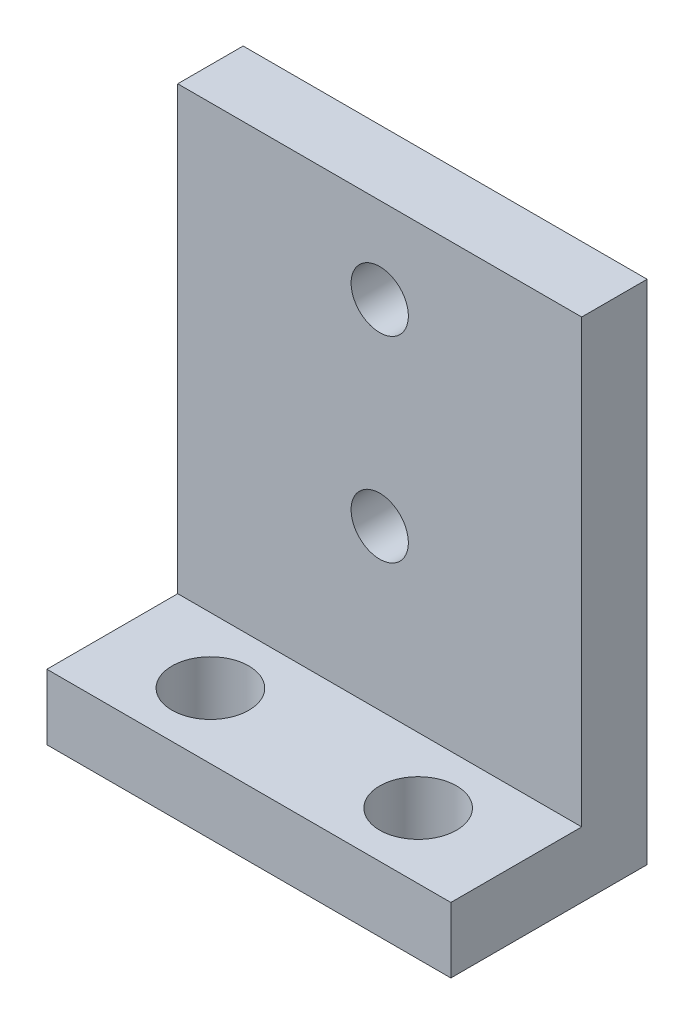
ISO-10303-21;
HEADER;
FILE_DESCRIPTION(('STEP AP214'),'2;1');
FILE_NAME('part.step','',(''),(''),'','','');
FILE_SCHEMA(('AUTOMOTIVE_DESIGN { 1 0 10303 214 1 1 1 1 }'));
ENDSEC;
DATA;
#1=APPLICATION_CONTEXT('core data for automotive mechanical design processes');
#2=APPLICATION_PROTOCOL_DEFINITION('international standard','automotive_design',2000,#1);
#3=PRODUCT_CONTEXT('',#1,'mechanical');
#4=PRODUCT('Part','Part','',(#3));
#5=PRODUCT_RELATED_PRODUCT_CATEGORY('part','',(#4));
#6=PRODUCT_DEFINITION_FORMATION('','',#4);
#7=PRODUCT_DEFINITION_CONTEXT('part definition',#1,'design');
#8=PRODUCT_DEFINITION('design','',#6,#7);
#9=PRODUCT_DEFINITION_SHAPE('','',#8);
#10=(LENGTH_UNIT() NAMED_UNIT(*) SI_UNIT(.MILLI.,.METRE.));
#11=(NAMED_UNIT(*) PLANE_ANGLE_UNIT() SI_UNIT($,.RADIAN.));
#12=(NAMED_UNIT(*) SI_UNIT($,.STERADIAN.) SOLID_ANGLE_UNIT());
#13=UNCERTAINTY_MEASURE_WITH_UNIT(LENGTH_MEASURE(1.E-05),#10,'distance_accuracy_value','');
#14=(GEOMETRIC_REPRESENTATION_CONTEXT(3) GLOBAL_UNCERTAINTY_ASSIGNED_CONTEXT((#13)) GLOBAL_UNIT_ASSIGNED_CONTEXT((#10,
#11,#12)) REPRESENTATION_CONTEXT('',''));
#15=CARTESIAN_POINT('',(0.,0.,0.));
#16=DIRECTION('',(0.,0.,1.));
#17=DIRECTION('',(1.,0.,0.));
#18=AXIS2_PLACEMENT_3D('',#15,#16,#17);
#19=CARTESIAN_POINT('',(0.,0.,0.));
#20=DIRECTION('',(0.,1.,0.));
#21=DIRECTION('',(0.,0.,1.));
#22=AXIS2_PLACEMENT_3D('',#19,#20,#21);
#23=PLANE('',#22);
#24=DIRECTION('',(0.,0.,-1.));
#25=VECTOR('',#24,1.);
#26=CARTESIAN_POINT('',(24.7,0.,0.));
#27=LINE('',#26,#25);
#28=CARTESIAN_POINT('',(24.7,0.,12.));
#29=VERTEX_POINT('',#28);
#30=CARTESIAN_POINT('',(24.7,0.,0.));
#31=VERTEX_POINT('',#30);
#32=EDGE_CURVE('E96',#29,#31,#27,.T.);
#33=ORIENTED_EDGE('',*,*,#32,.F.);
#34=DIRECTION('',(1.,0.,0.));
#35=VECTOR('',#34,1.);
#36=CARTESIAN_POINT('',(0.,0.,12.));
#37=LINE('',#36,#35);
#38=CARTESIAN_POINT('',(0.,0.,12.));
#39=VERTEX_POINT('',#38);
#40=EDGE_CURVE('E82',#39,#29,#37,.T.);
#41=ORIENTED_EDGE('',*,*,#40,.F.);
#42=DIRECTION('',(0.,0.,-1.));
#43=VECTOR('',#42,1.);
#44=CARTESIAN_POINT('',(0.,0.,0.));
#45=LINE('',#44,#43);
#46=CARTESIAN_POINT('',(0.,0.,0.));
#47=VERTEX_POINT('',#46);
#48=EDGE_CURVE('E73',#39,#47,#45,.T.);
#49=ORIENTED_EDGE('',*,*,#48,.T.);
#50=DIRECTION('',(1.,0.,0.));
#51=VECTOR('',#50,1.);
#52=CARTESIAN_POINT('',(0.,0.,0.));
#53=LINE('',#52,#51);
#54=EDGE_CURVE('E79',#47,#31,#53,.T.);
#55=ORIENTED_EDGE('',*,*,#54,.T.);
#56=EDGE_LOOP('',(#33,#41,#49,#55));
#57=FACE_BOUND('',#56,.T.);
#58=CARTESIAN_POINT('',(18.7,0.,8.));
#59=DIRECTION('',(0.,1.,0.));
#60=DIRECTION('',(0.,0.,1.));
#61=AXIS2_PLACEMENT_3D('',#58,#59,#60);
#62=CIRCLE('',#61,2.3495);
#63=CARTESIAN_POINT('',(18.7,0.,10.3495));
#64=VERTEX_POINT('',#63);
#65=EDGE_CURVE('E157',#64,#64,#62,.T.);
#66=ORIENTED_EDGE('',*,*,#65,.T.);
#67=EDGE_LOOP('',(#66));
#68=FACE_BOUND('',#67,.T.);
#69=CARTESIAN_POINT('',(6.,0.,8.));
#70=DIRECTION('',(0.,1.,0.));
#71=DIRECTION('',(0.,0.,1.));
#72=AXIS2_PLACEMENT_3D('',#69,#70,#71);
#73=CIRCLE('',#72,2.3495);
#74=CARTESIAN_POINT('',(6.,0.,10.3495));
#75=VERTEX_POINT('',#74);
#76=EDGE_CURVE('E23',#75,#75,#73,.T.);
#77=ORIENTED_EDGE('',*,*,#76,.T.);
#78=EDGE_LOOP('',(#77));
#79=FACE_BOUND('',#78,.T.);
#80=ADVANCED_FACE('F20',(#57,#68,#79),#23,.F.);
#81=CARTESIAN_POINT('',(0.,0.,12.));
#82=DIRECTION('',(0.,0.,1.));
#83=DIRECTION('',(1.,0.,0.));
#84=AXIS2_PLACEMENT_3D('',#81,#82,#83);
#85=PLANE('',#84);
#86=DIRECTION('',(0.,1.,0.));
#87=VECTOR('',#86,1.);
#88=CARTESIAN_POINT('',(24.7,0.,12.));
#89=LINE('',#88,#87);
#90=CARTESIAN_POINT('',(24.7,4.,12.));
#91=VERTEX_POINT('',#90);
#92=EDGE_CURVE('E158',#29,#91,#89,.T.);
#93=ORIENTED_EDGE('',*,*,#92,.T.);
#94=DIRECTION('',(1.,0.,0.));
#95=VECTOR('',#94,1.);
#96=CARTESIAN_POINT('',(0.,4.,12.));
#97=LINE('',#96,#95);
#98=CARTESIAN_POINT('',(0.,4.,12.));
#99=VERTEX_POINT('',#98);
#100=EDGE_CURVE('E144',#99,#91,#97,.T.);
#101=ORIENTED_EDGE('',*,*,#100,.F.);
#102=DIRECTION('',(0.,1.,0.));
#103=VECTOR('',#102,1.);
#104=CARTESIAN_POINT('',(0.,0.,12.));
#105=LINE('',#104,#103);
#106=EDGE_CURVE('E85',#99,#39,#105,.F.);
#107=ORIENTED_EDGE('',*,*,#106,.T.);
#108=ORIENTED_EDGE('',*,*,#40,.T.);
#109=EDGE_LOOP('',(#93,#101,#107,#108));
#110=FACE_BOUND('',#109,.T.);
#111=ADVANCED_FACE('F219',(#110),#85,.T.);
#112=CARTESIAN_POINT('',(6.,5.,8.));
#113=DIRECTION('',(0.,1.,0.));
#114=DIRECTION('',(0.,0.,1.));
#115=AXIS2_PLACEMENT_3D('',#112,#113,#114);
#116=CYLINDRICAL_SURFACE('',#115,2.3495);
#117=ORIENTED_EDGE('',*,*,#76,.F.);
#118=EDGE_LOOP('',(#117));
#119=FACE_BOUND('',#118,.T.);
#120=CARTESIAN_POINT('',(6.,4.,8.));
#121=DIRECTION('',(0.,1.,0.));
#122=DIRECTION('',(0.,0.,1.));
#123=AXIS2_PLACEMENT_3D('',#120,#121,#122);
#124=CIRCLE('',#123,2.3495);
#125=CARTESIAN_POINT('',(6.,4.,10.3495));
#126=VERTEX_POINT('',#125);
#127=EDGE_CURVE('E147',#126,#126,#124,.F.);
#128=ORIENTED_EDGE('',*,*,#127,.F.);
#129=EDGE_LOOP('',(#128));
#130=FACE_BOUND('',#129,.T.);
#131=ADVANCED_FACE('F216',(#119,#130),#116,.F.);
#132=CARTESIAN_POINT('',(18.7,5.,8.));
#133=DIRECTION('',(0.,1.,0.));
#134=DIRECTION('',(0.,0.,1.));
#135=AXIS2_PLACEMENT_3D('',#132,#133,#134);
#136=CYLINDRICAL_SURFACE('',#135,2.3495);
#137=ORIENTED_EDGE('',*,*,#65,.F.);
#138=EDGE_LOOP('',(#137));
#139=FACE_BOUND('',#138,.T.);
#140=CARTESIAN_POINT('',(18.7,4.,8.));
#141=DIRECTION('',(0.,1.,0.));
#142=DIRECTION('',(0.,0.,1.));
#143=AXIS2_PLACEMENT_3D('',#140,#141,#142);
#144=CIRCLE('',#143,2.3495);
#145=CARTESIAN_POINT('',(18.7,4.,10.3495));
#146=VERTEX_POINT('',#145);
#147=EDGE_CURVE('E143',#146,#146,#144,.F.);
#148=ORIENTED_EDGE('',*,*,#147,.F.);
#149=EDGE_LOOP('',(#148));
#150=FACE_BOUND('',#149,.T.);
#151=ADVANCED_FACE('F213',(#139,#150),#136,.F.);
#152=CARTESIAN_POINT('',(0.,0.,0.));
#153=DIRECTION('',(0.,0.,1.));
#154=DIRECTION('',(1.,0.,0.));
#155=AXIS2_PLACEMENT_3D('',#152,#153,#154);
#156=PLANE('',#155);
#157=CARTESIAN_POINT('',(12.35,25.75,0.));
#158=DIRECTION('',(0.,0.,-1.));
#159=DIRECTION('',(-1.,0.,0.));
#160=AXIS2_PLACEMENT_3D('',#157,#158,#159);
#161=CIRCLE('',#160,1.75);
#162=CARTESIAN_POINT('',(10.6,25.75,0.));
#163=VERTEX_POINT('',#162);
#164=EDGE_CURVE('E127',#163,#163,#161,.F.);
#165=ORIENTED_EDGE('',*,*,#164,.T.);
#166=EDGE_LOOP('',(#165));
#167=FACE_BOUND('',#166,.T.);
#168=CARTESIAN_POINT('',(12.35,13.75,0.));
#169=DIRECTION('',(0.,0.,-1.));
#170=DIRECTION('',(-1.,0.,0.));
#171=AXIS2_PLACEMENT_3D('',#168,#169,#170);
#172=CIRCLE('',#171,1.75);
#173=CARTESIAN_POINT('',(10.6,13.75,0.));
#174=VERTEX_POINT('',#173);
#175=EDGE_CURVE('E130',#174,#174,#172,.F.);
#176=ORIENTED_EDGE('',*,*,#175,.T.);
#177=EDGE_LOOP('',(#176));
#178=FACE_BOUND('',#177,.T.);
#179=DIRECTION('',(0.,1.,0.));
#180=VECTOR('',#179,1.);
#181=CARTESIAN_POINT('',(24.7,0.,0.));
#182=LINE('',#181,#180);
#183=CARTESIAN_POINT('',(24.7,31.,0.));
#184=VERTEX_POINT('',#183);
#185=EDGE_CURVE('E99',#31,#184,#182,.T.);
#186=ORIENTED_EDGE('',*,*,#185,.F.);
#187=ORIENTED_EDGE('',*,*,#54,.F.);
#188=DIRECTION('',(0.,1.,0.));
#189=VECTOR('',#188,1.);
#190=CARTESIAN_POINT('',(0.,0.,0.));
#191=LINE('',#190,#189);
#192=CARTESIAN_POINT('',(0.,31.,0.));
#193=VERTEX_POINT('',#192);
#194=EDGE_CURVE('E88',#47,#193,#191,.T.);
#195=ORIENTED_EDGE('',*,*,#194,.T.);
#196=DIRECTION('',(1.,0.,0.));
#197=VECTOR('',#196,1.);
#198=CARTESIAN_POINT('',(0.,31.,0.));
#199=LINE('',#198,#197);
#200=EDGE_CURVE('E134',#184,#193,#199,.F.);
#201=ORIENTED_EDGE('',*,*,#200,.F.);
#202=EDGE_LOOP('',(#186,#187,#195,#201));
#203=FACE_BOUND('',#202,.T.);
#204=ADVANCED_FACE('F98',(#167,#178,#203),#156,.F.);
#205=CARTESIAN_POINT('',(0.,0.,0.));
#206=DIRECTION('',(1.,0.,0.));
#207=DIRECTION('',(0.,0.,-1.));
#208=AXIS2_PLACEMENT_3D('',#205,#206,#207);
#209=PLANE('',#208);
#210=DIRECTION('',(0.,0.,1.));
#211=VECTOR('',#210,1.);
#212=CARTESIAN_POINT('',(0.,31.,0.));
#213=LINE('',#212,#211);
#214=CARTESIAN_POINT('',(0.,31.,4.));
#215=VERTEX_POINT('',#214);
#216=EDGE_CURVE('E91',#193,#215,#213,.T.);
#217=ORIENTED_EDGE('',*,*,#216,.F.);
#218=ORIENTED_EDGE('',*,*,#194,.F.);
#219=ORIENTED_EDGE('',*,*,#48,.F.);
#220=ORIENTED_EDGE('',*,*,#106,.F.);
#221=DIRECTION('',(0.,0.,1.));
#222=VECTOR('',#221,1.);
#223=CARTESIAN_POINT('',(0.,4.,0.));
#224=LINE('',#223,#222);
#225=CARTESIAN_POINT('',(0.,4.,4.));
#226=VERTEX_POINT('',#225);
#227=EDGE_CURVE('E148',#226,#99,#224,.T.);
#228=ORIENTED_EDGE('',*,*,#227,.F.);
#229=DIRECTION('',(0.,1.,0.));
#230=VECTOR('',#229,1.);
#231=CARTESIAN_POINT('',(0.,0.,4.));
#232=LINE('',#231,#230);
#233=EDGE_CURVE('E123',#215,#226,#232,.F.);
#234=ORIENTED_EDGE('',*,*,#233,.F.);
#235=EDGE_LOOP('',(#217,#218,#219,#220,#228,#234));
#236=FACE_BOUND('',#235,.T.);
#237=ADVANCED_FACE('F89',(#236),#209,.F.);
#238=CARTESIAN_POINT('',(0.,4.,0.));
#239=DIRECTION('',(0.,1.,0.));
#240=DIRECTION('',(0.,0.,1.));
#241=AXIS2_PLACEMENT_3D('',#238,#239,#240);
#242=PLANE('',#241);
#243=ORIENTED_EDGE('',*,*,#147,.T.);
#244=EDGE_LOOP('',(#243));
#245=FACE_BOUND('',#244,.T.);
#246=ORIENTED_EDGE('',*,*,#127,.T.);
#247=EDGE_LOOP('',(#246));
#248=FACE_BOUND('',#247,.T.);
#249=ORIENTED_EDGE('',*,*,#227,.T.);
#250=ORIENTED_EDGE('',*,*,#100,.T.);
#251=DIRECTION('',(0.,0.,1.));
#252=VECTOR('',#251,1.);
#253=CARTESIAN_POINT('',(24.7,4.,0.));
#254=LINE('',#253,#252);
#255=CARTESIAN_POINT('',(24.7,4.,4.));
#256=VERTEX_POINT('',#255);
#257=EDGE_CURVE('E95',#91,#256,#254,.F.);
#258=ORIENTED_EDGE('',*,*,#257,.T.);
#259=DIRECTION('',(1.,0.,0.));
#260=VECTOR('',#259,1.);
#261=CARTESIAN_POINT('',(0.,4.,4.));
#262=LINE('',#261,#260);
#263=EDGE_CURVE('E119',#226,#256,#262,.T.);
#264=ORIENTED_EDGE('',*,*,#263,.F.);
#265=EDGE_LOOP('',(#249,#250,#258,#264));
#266=FACE_BOUND('',#265,.T.);
#267=ADVANCED_FACE('F205',(#245,#248,#266),#242,.T.);
#268=CARTESIAN_POINT('',(24.7,0.,0.));
#269=DIRECTION('',(1.,0.,0.));
#270=DIRECTION('',(0.,0.,-1.));
#271=AXIS2_PLACEMENT_3D('',#268,#269,#270);
#272=PLANE('',#271);
#273=DIRECTION('',(0.,0.,1.));
#274=VECTOR('',#273,1.);
#275=CARTESIAN_POINT('',(24.7,31.,0.));
#276=LINE('',#275,#274);
#277=CARTESIAN_POINT('',(24.7,31.,4.));
#278=VERTEX_POINT('',#277);
#279=EDGE_CURVE('E40',#278,#184,#276,.F.);
#280=ORIENTED_EDGE('',*,*,#279,.F.);
#281=DIRECTION('',(0.,1.,0.));
#282=VECTOR('',#281,1.);
#283=CARTESIAN_POINT('',(24.7,0.,4.));
#284=LINE('',#283,#282);
#285=EDGE_CURVE('E112',#256,#278,#284,.T.);
#286=ORIENTED_EDGE('',*,*,#285,.F.);
#287=ORIENTED_EDGE('',*,*,#257,.F.);
#288=ORIENTED_EDGE('',*,*,#92,.F.);
#289=ORIENTED_EDGE('',*,*,#32,.T.);
#290=ORIENTED_EDGE('',*,*,#185,.T.);
#291=EDGE_LOOP('',(#280,#286,#287,#288,#289,#290));
#292=FACE_BOUND('',#291,.T.);
#293=ADVANCED_FACE('F201',(#292),#272,.T.);
#294=CARTESIAN_POINT('',(0.,31.,0.));
#295=DIRECTION('',(0.,1.,0.));
#296=DIRECTION('',(0.,0.,1.));
#297=AXIS2_PLACEMENT_3D('',#294,#295,#296);
#298=PLANE('',#297);
#299=DIRECTION('',(1.,0.,0.));
#300=VECTOR('',#299,1.);
#301=CARTESIAN_POINT('',(0.,31.,4.));
#302=LINE('',#301,#300);
#303=EDGE_CURVE('E118',#278,#215,#302,.F.);
#304=ORIENTED_EDGE('',*,*,#303,.F.);
#305=ORIENTED_EDGE('',*,*,#279,.T.);
#306=ORIENTED_EDGE('',*,*,#200,.T.);
#307=ORIENTED_EDGE('',*,*,#216,.T.);
#308=EDGE_LOOP('',(#304,#305,#306,#307));
#309=FACE_BOUND('',#308,.T.);
#310=ADVANCED_FACE('F194',(#309),#298,.T.);
#311=CARTESIAN_POINT('',(12.35,13.75,-1.));
#312=DIRECTION('',(0.,0.,-1.));
#313=DIRECTION('',(-1.,0.,0.));
#314=AXIS2_PLACEMENT_3D('',#311,#312,#313);
#315=CYLINDRICAL_SURFACE('',#314,1.75);
#316=CARTESIAN_POINT('',(12.35,13.75,4.));
#317=DIRECTION('',(0.,0.,-1.));
#318=DIRECTION('',(-1.,0.,0.));
#319=AXIS2_PLACEMENT_3D('',#316,#317,#318);
#320=CIRCLE('',#319,1.75);
#321=CARTESIAN_POINT('',(10.6,13.75,4.));
#322=VERTEX_POINT('',#321);
#323=EDGE_CURVE('E31',#322,#322,#320,.T.);
#324=ORIENTED_EDGE('',*,*,#323,.F.);
#325=EDGE_LOOP('',(#324));
#326=FACE_BOUND('',#325,.T.);
#327=ORIENTED_EDGE('',*,*,#175,.F.);
#328=EDGE_LOOP('',(#327));
#329=FACE_BOUND('',#328,.T.);
#330=ADVANCED_FACE('F184',(#326,#329),#315,.F.);
#331=CARTESIAN_POINT('',(12.35,25.75,-1.));
#332=DIRECTION('',(0.,0.,-1.));
#333=DIRECTION('',(-1.,0.,0.));
#334=AXIS2_PLACEMENT_3D('',#331,#332,#333);
#335=CYLINDRICAL_SURFACE('',#334,1.75);
#336=CARTESIAN_POINT('',(12.35,25.75,4.));
#337=DIRECTION('',(0.,0.,-1.));
#338=DIRECTION('',(-1.,0.,0.));
#339=AXIS2_PLACEMENT_3D('',#336,#337,#338);
#340=CIRCLE('',#339,1.75);
#341=CARTESIAN_POINT('',(10.6,25.75,4.));
#342=VERTEX_POINT('',#341);
#343=EDGE_CURVE('E12',#342,#342,#340,.T.);
#344=ORIENTED_EDGE('',*,*,#343,.F.);
#345=EDGE_LOOP('',(#344));
#346=FACE_BOUND('',#345,.T.);
#347=ORIENTED_EDGE('',*,*,#164,.F.);
#348=EDGE_LOOP('',(#347));
#349=FACE_BOUND('',#348,.T.);
#350=ADVANCED_FACE('F181',(#346,#349),#335,.F.);
#351=CARTESIAN_POINT('',(0.,0.,4.));
#352=DIRECTION('',(0.,0.,1.));
#353=DIRECTION('',(1.,0.,0.));
#354=AXIS2_PLACEMENT_3D('',#351,#352,#353);
#355=PLANE('',#354);
#356=ORIENTED_EDGE('',*,*,#343,.T.);
#357=EDGE_LOOP('',(#356));
#358=FACE_BOUND('',#357,.T.);
#359=ORIENTED_EDGE('',*,*,#323,.T.);
#360=EDGE_LOOP('',(#359));
#361=FACE_BOUND('',#360,.T.);
#362=ORIENTED_EDGE('',*,*,#285,.T.);
#363=ORIENTED_EDGE('',*,*,#303,.T.);
#364=ORIENTED_EDGE('',*,*,#233,.T.);
#365=ORIENTED_EDGE('',*,*,#263,.T.);
#366=EDGE_LOOP('',(#362,#363,#364,#365));
#367=FACE_BOUND('',#366,.T.);
#368=ADVANCED_FACE('F183',(#358,#361,#367),#355,.T.);
#369=CLOSED_SHELL('',(#80,#111,#131,#151,#204,#237,#267,#293,#310,#330,#350,#368));
#370=MANIFOLD_SOLID_BREP('B1',#369);
#371=ADVANCED_BREP_SHAPE_REPRESENTATION('',(#18,#370),#14);
#372=SHAPE_DEFINITION_REPRESENTATION(#9,#371);
ENDSEC;
END-ISO-10303-21;
